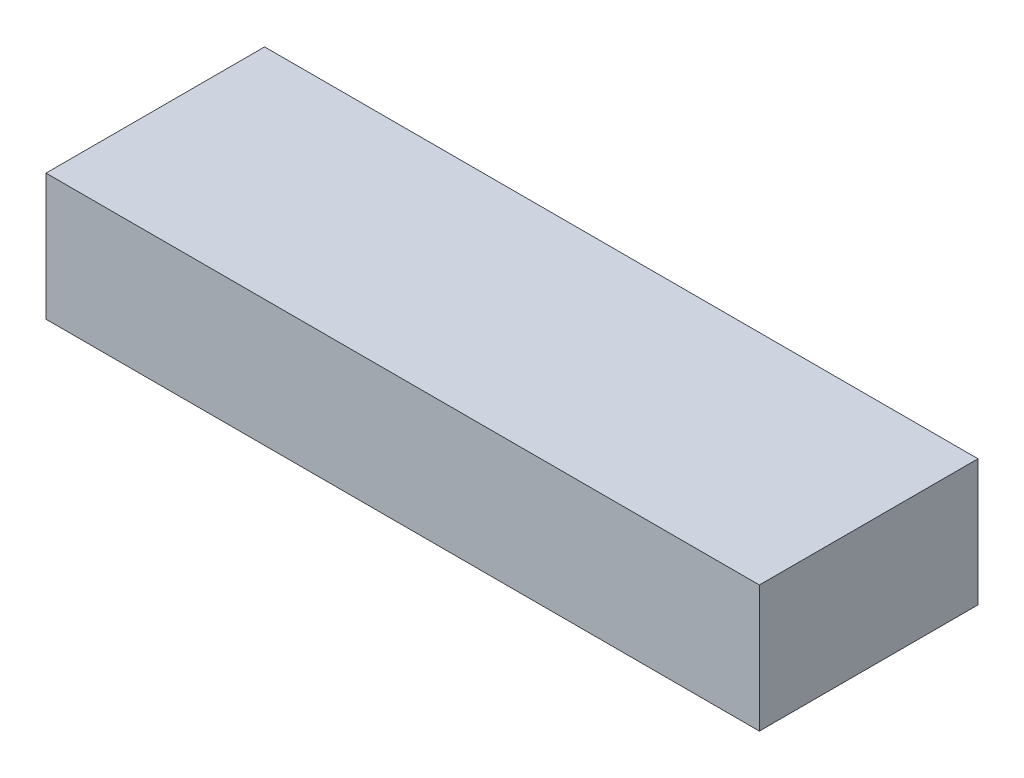
ISO-10303-21;
HEADER;
FILE_DESCRIPTION(('STEP AP214'),'2;1');
FILE_NAME('part.step','',(''),(''),'','','');
FILE_SCHEMA(('AUTOMOTIVE_DESIGN { 1 0 10303 214 1 1 1 1 }'));
ENDSEC;
DATA;
#1=APPLICATION_CONTEXT('core data for automotive mechanical design processes');
#2=APPLICATION_PROTOCOL_DEFINITION('international standard','automotive_design',2000,#1);
#3=PRODUCT_CONTEXT('',#1,'mechanical');
#4=PRODUCT('Part','Part','',(#3));
#5=PRODUCT_RELATED_PRODUCT_CATEGORY('part','',(#4));
#6=PRODUCT_DEFINITION_FORMATION('','',#4);
#7=PRODUCT_DEFINITION_CONTEXT('part definition',#1,'design');
#8=PRODUCT_DEFINITION('design','',#6,#7);
#9=PRODUCT_DEFINITION_SHAPE('','',#8);
#10=(LENGTH_UNIT() NAMED_UNIT(*) SI_UNIT(.MILLI.,.METRE.));
#11=(NAMED_UNIT(*) PLANE_ANGLE_UNIT() SI_UNIT($,.RADIAN.));
#12=(NAMED_UNIT(*) SI_UNIT($,.STERADIAN.) SOLID_ANGLE_UNIT());
#13=UNCERTAINTY_MEASURE_WITH_UNIT(LENGTH_MEASURE(1.E-05),#10,'distance_accuracy_value','');
#14=(GEOMETRIC_REPRESENTATION_CONTEXT(3) GLOBAL_UNCERTAINTY_ASSIGNED_CONTEXT((#13)) GLOBAL_UNIT_ASSIGNED_CONTEXT((#10,
#11,#12)) REPRESENTATION_CONTEXT('',''));
#15=CARTESIAN_POINT('',(0.,0.,0.));
#16=DIRECTION('',(0.,0.,1.));
#17=DIRECTION('',(1.,0.,0.));
#18=AXIS2_PLACEMENT_3D('',#15,#16,#17);
#19=CARTESIAN_POINT('',(0.,0.,19.));
#20=DIRECTION('',(1.,0.,0.));
#21=DIRECTION('',(0.,0.,-1.));
#22=AXIS2_PLACEMENT_3D('',#19,#20,#21);
#23=PLANE('',#22);
#24=DIRECTION('',(0.,-1.,0.));
#25=VECTOR('',#24,1.);
#26=CARTESIAN_POINT('',(0.,0.,0.));
#27=LINE('',#26,#25);
#28=CARTESIAN_POINT('',(0.,11.,0.));
#29=VERTEX_POINT('',#28);
#30=CARTESIAN_POINT('',(0.,0.,0.));
#31=VERTEX_POINT('',#30);
#32=EDGE_CURVE('E96',#29,#31,#27,.T.);
#33=ORIENTED_EDGE('',*,*,#32,.T.);
#34=DIRECTION('',(0.,0.,-1.));
#35=VECTOR('',#34,1.);
#36=CARTESIAN_POINT('',(0.,0.,19.));
#37=LINE('',#36,#35);
#38=CARTESIAN_POINT('',(0.,0.,19.));
#39=VERTEX_POINT('',#38);
#40=EDGE_CURVE('E11',#39,#31,#37,.T.);
#41=ORIENTED_EDGE('',*,*,#40,.F.);
#42=DIRECTION('',(0.,-1.,0.));
#43=VECTOR('',#42,1.);
#44=CARTESIAN_POINT('',(0.,0.,19.));
#45=LINE('',#44,#43);
#46=CARTESIAN_POINT('',(0.,11.,19.));
#47=VERTEX_POINT('',#46);
#48=EDGE_CURVE('E84',#47,#39,#45,.T.);
#49=ORIENTED_EDGE('',*,*,#48,.F.);
#50=DIRECTION('',(0.,0.,-1.));
#51=VECTOR('',#50,1.);
#52=CARTESIAN_POINT('',(0.,11.,19.));
#53=LINE('',#52,#51);
#54=EDGE_CURVE('E92',#47,#29,#53,.T.);
#55=ORIENTED_EDGE('',*,*,#54,.T.);
#56=EDGE_LOOP('',(#33,#41,#49,#55));
#57=FACE_BOUND('',#56,.T.);
#58=ADVANCED_FACE('F33',(#57),#23,.F.);
#59=CARTESIAN_POINT('',(0.,0.,19.));
#60=DIRECTION('',(0.,1.,0.));
#61=DIRECTION('',(0.,0.,1.));
#62=AXIS2_PLACEMENT_3D('',#59,#60,#61);
#63=PLANE('',#62);
#64=DIRECTION('',(1.,0.,0.));
#65=VECTOR('',#64,1.);
#66=CARTESIAN_POINT('',(0.,0.,0.));
#67=LINE('',#66,#65);
#68=CARTESIAN_POINT('',(62.,0.,0.));
#69=VERTEX_POINT('',#68);
#70=EDGE_CURVE('E88',#31,#69,#67,.T.);
#71=ORIENTED_EDGE('',*,*,#70,.T.);
#72=DIRECTION('',(0.,0.,-1.));
#73=VECTOR('',#72,1.);
#74=CARTESIAN_POINT('',(62.,0.,19.));
#75=LINE('',#74,#73);
#76=CARTESIAN_POINT('',(62.,0.,19.));
#77=VERTEX_POINT('',#76);
#78=EDGE_CURVE('E41',#77,#69,#75,.T.);
#79=ORIENTED_EDGE('',*,*,#78,.F.);
#80=DIRECTION('',(1.,0.,0.));
#81=VECTOR('',#80,1.);
#82=CARTESIAN_POINT('',(0.,0.,19.));
#83=LINE('',#82,#81);
#84=EDGE_CURVE('E79',#39,#77,#83,.T.);
#85=ORIENTED_EDGE('',*,*,#84,.F.);
#86=ORIENTED_EDGE('',*,*,#40,.T.);
#87=EDGE_LOOP('',(#71,#79,#85,#86));
#88=FACE_BOUND('',#87,.T.);
#89=ADVANCED_FACE('F87',(#88),#63,.F.);
#90=CARTESIAN_POINT('',(62.,0.,19.));
#91=DIRECTION('',(-1.,0.,0.));
#92=DIRECTION('',(0.,0.,1.));
#93=AXIS2_PLACEMENT_3D('',#90,#91,#92);
#94=PLANE('',#93);
#95=DIRECTION('',(0.,1.,0.));
#96=VECTOR('',#95,1.);
#97=CARTESIAN_POINT('',(62.,0.,0.));
#98=LINE('',#97,#96);
#99=CARTESIAN_POINT('',(62.,11.,0.));
#100=VERTEX_POINT('',#99);
#101=EDGE_CURVE('E66',#69,#100,#98,.T.);
#102=ORIENTED_EDGE('',*,*,#101,.T.);
#103=DIRECTION('',(0.,0.,-1.));
#104=VECTOR('',#103,1.);
#105=CARTESIAN_POINT('',(62.,11.,19.));
#106=LINE('',#105,#104);
#107=CARTESIAN_POINT('',(62.,11.,19.));
#108=VERTEX_POINT('',#107);
#109=EDGE_CURVE('E89',#108,#100,#106,.T.);
#110=ORIENTED_EDGE('',*,*,#109,.F.);
#111=DIRECTION('',(0.,1.,0.));
#112=VECTOR('',#111,1.);
#113=CARTESIAN_POINT('',(62.,0.,19.));
#114=LINE('',#113,#112);
#115=EDGE_CURVE('E82',#77,#108,#114,.T.);
#116=ORIENTED_EDGE('',*,*,#115,.F.);
#117=ORIENTED_EDGE('',*,*,#78,.T.);
#118=EDGE_LOOP('',(#102,#110,#116,#117));
#119=FACE_BOUND('',#118,.T.);
#120=ADVANCED_FACE('F90',(#119),#94,.F.);
#121=CARTESIAN_POINT('',(0.,11.,19.));
#122=DIRECTION('',(0.,-1.,0.));
#123=DIRECTION('',(0.,0.,-1.));
#124=AXIS2_PLACEMENT_3D('',#121,#122,#123);
#125=PLANE('',#124);
#126=DIRECTION('',(-1.,0.,0.));
#127=VECTOR('',#126,1.);
#128=CARTESIAN_POINT('',(0.,11.,0.));
#129=LINE('',#128,#127);
#130=EDGE_CURVE('E72',#100,#29,#129,.T.);
#131=ORIENTED_EDGE('',*,*,#130,.T.);
#132=ORIENTED_EDGE('',*,*,#54,.F.);
#133=DIRECTION('',(-1.,0.,0.));
#134=VECTOR('',#133,1.);
#135=CARTESIAN_POINT('',(0.,11.,19.));
#136=LINE('',#135,#134);
#137=EDGE_CURVE('E49',#108,#47,#136,.T.);
#138=ORIENTED_EDGE('',*,*,#137,.F.);
#139=ORIENTED_EDGE('',*,*,#109,.T.);
#140=EDGE_LOOP('',(#131,#132,#138,#139));
#141=FACE_BOUND('',#140,.T.);
#142=ADVANCED_FACE('F103',(#141),#125,.F.);
#143=CARTESIAN_POINT('',(0.,0.,19.));
#144=DIRECTION('',(0.,0.,-1.));
#145=DIRECTION('',(-1.,0.,0.));
#146=AXIS2_PLACEMENT_3D('',#143,#144,#145);
#147=PLANE('',#146);
#148=ORIENTED_EDGE('',*,*,#48,.T.);
#149=ORIENTED_EDGE('',*,*,#84,.T.);
#150=ORIENTED_EDGE('',*,*,#115,.T.);
#151=ORIENTED_EDGE('',*,*,#137,.T.);
#152=EDGE_LOOP('',(#148,#149,#150,#151));
#153=FACE_BOUND('',#152,.T.);
#154=ADVANCED_FACE('F80',(#153),#147,.F.);
#155=CARTESIAN_POINT('',(0.,0.,0.));
#156=DIRECTION('',(0.,0.,-1.));
#157=DIRECTION('',(-1.,0.,0.));
#158=AXIS2_PLACEMENT_3D('',#155,#156,#157);
#159=PLANE('',#158);
#160=ORIENTED_EDGE('',*,*,#32,.F.);
#161=ORIENTED_EDGE('',*,*,#130,.F.);
#162=ORIENTED_EDGE('',*,*,#101,.F.);
#163=ORIENTED_EDGE('',*,*,#70,.F.);
#164=EDGE_LOOP('',(#160,#161,#162,#163));
#165=FACE_BOUND('',#164,.T.);
#166=ADVANCED_FACE('F106',(#165),#159,.T.);
#167=CLOSED_SHELL('',(#58,#89,#120,#142,#154,#166));
#168=MANIFOLD_SOLID_BREP('B2',#167);
#169=ADVANCED_BREP_SHAPE_REPRESENTATION('',(#18,#168),#14);
#170=SHAPE_DEFINITION_REPRESENTATION(#9,#169);
ENDSEC;
END-ISO-10303-21;
